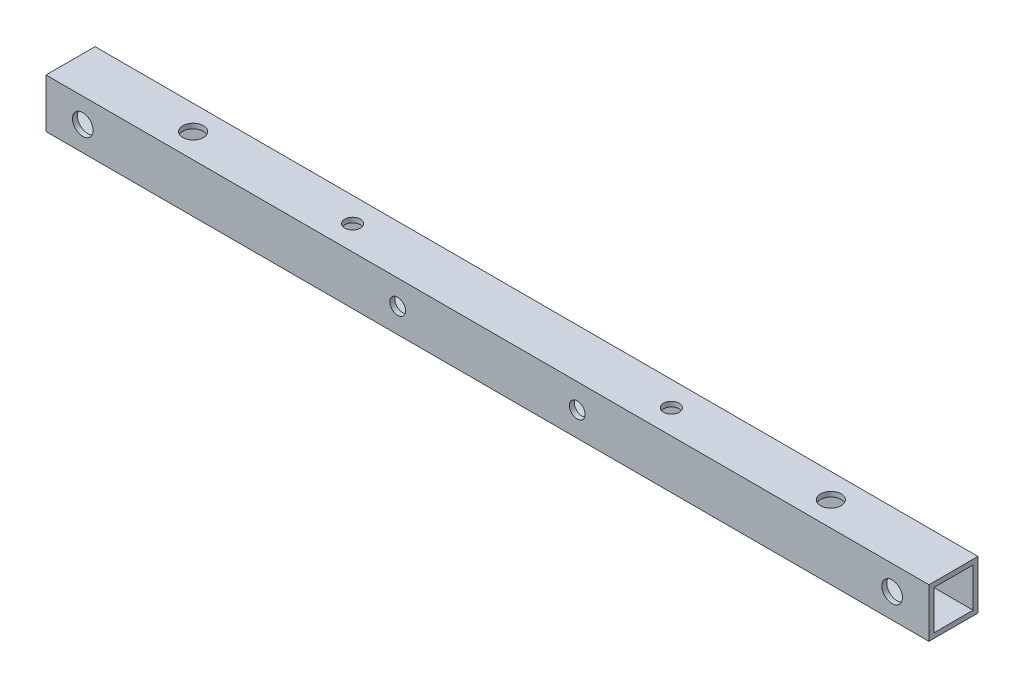
ISO-10303-21;
HEADER;
FILE_DESCRIPTION(('STEP AP214'),'2;1');
FILE_NAME('part.step','',(''),(''),'','','');
FILE_SCHEMA(('AUTOMOTIVE_DESIGN { 1 0 10303 214 1 1 1 1 }'));
ENDSEC;
DATA;
#1=APPLICATION_CONTEXT('core data for automotive mechanical design processes');
#2=APPLICATION_PROTOCOL_DEFINITION('international standard','automotive_design',2000,#1);
#3=PRODUCT_CONTEXT('',#1,'mechanical');
#4=PRODUCT('Part','Part','',(#3));
#5=PRODUCT_RELATED_PRODUCT_CATEGORY('part','',(#4));
#6=PRODUCT_DEFINITION_FORMATION('','',#4);
#7=PRODUCT_DEFINITION_CONTEXT('part definition',#1,'design');
#8=PRODUCT_DEFINITION('design','',#6,#7);
#9=PRODUCT_DEFINITION_SHAPE('','',#8);
#10=(LENGTH_UNIT() NAMED_UNIT(*) SI_UNIT(.MILLI.,.METRE.));
#11=(NAMED_UNIT(*) PLANE_ANGLE_UNIT() SI_UNIT($,.RADIAN.));
#12=(NAMED_UNIT(*) SI_UNIT($,.STERADIAN.) SOLID_ANGLE_UNIT());
#13=UNCERTAINTY_MEASURE_WITH_UNIT(LENGTH_MEASURE(1.E-05),#10,'distance_accuracy_value','');
#14=(GEOMETRIC_REPRESENTATION_CONTEXT(3) GLOBAL_UNCERTAINTY_ASSIGNED_CONTEXT((#13)) GLOBAL_UNIT_ASSIGNED_CONTEXT((#10,
#11,#12)) REPRESENTATION_CONTEXT('',''));
#15=CARTESIAN_POINT('',(0.,0.,0.));
#16=DIRECTION('',(0.,0.,1.));
#17=DIRECTION('',(1.,0.,0.));
#18=AXIS2_PLACEMENT_3D('',#15,#16,#17);
#19=CARTESIAN_POINT('',(180.,0.,0.));
#20=DIRECTION('',(1.,0.,0.));
#21=DIRECTION('',(0.,0.,-1.));
#22=AXIS2_PLACEMENT_3D('',#19,#20,#21);
#23=PLANE('',#22);
#24=DIRECTION('',(0.,1.,0.));
#25=VECTOR('',#24,1.);
#26=CARTESIAN_POINT('',(180.,5.,-5.));
#27=LINE('',#26,#25);
#28=CARTESIAN_POINT('',(180.,-5.,-5.));
#29=VERTEX_POINT('',#28);
#30=CARTESIAN_POINT('',(180.,5.,-5.));
#31=VERTEX_POINT('',#30);
#32=EDGE_CURVE('E164',#29,#31,#27,.T.);
#33=ORIENTED_EDGE('',*,*,#32,.T.);
#34=DIRECTION('',(0.,0.,1.));
#35=VECTOR('',#34,1.);
#36=CARTESIAN_POINT('',(180.,5.,5.));
#37=LINE('',#36,#35);
#38=CARTESIAN_POINT('',(180.,5.,5.));
#39=VERTEX_POINT('',#38);
#40=EDGE_CURVE('E167',#31,#39,#37,.T.);
#41=ORIENTED_EDGE('',*,*,#40,.T.);
#42=DIRECTION('',(0.,-1.,0.));
#43=VECTOR('',#42,1.);
#44=CARTESIAN_POINT('',(180.,5.,5.));
#45=LINE('',#44,#43);
#46=CARTESIAN_POINT('',(180.,-5.,5.));
#47=VERTEX_POINT('',#46);
#48=EDGE_CURVE('E170',#39,#47,#45,.T.);
#49=ORIENTED_EDGE('',*,*,#48,.T.);
#50=DIRECTION('',(0.,0.,-1.));
#51=VECTOR('',#50,1.);
#52=CARTESIAN_POINT('',(180.,-5.,5.));
#53=LINE('',#52,#51);
#54=EDGE_CURVE('E172',#47,#29,#53,.T.);
#55=ORIENTED_EDGE('',*,*,#54,.T.);
#56=EDGE_LOOP('',(#33,#41,#49,#55));
#57=FACE_BOUND('',#56,.T.);
#58=DIRECTION('',(0.,0.,1.));
#59=VECTOR('',#58,1.);
#60=CARTESIAN_POINT('',(180.,4.,5.));
#61=LINE('',#60,#59);
#62=CARTESIAN_POINT('',(180.,4.,-4.));
#63=VERTEX_POINT('',#62);
#64=CARTESIAN_POINT('',(180.,4.,4.));
#65=VERTEX_POINT('',#64);
#66=EDGE_CURVE('E134',#63,#65,#61,.T.);
#67=ORIENTED_EDGE('',*,*,#66,.F.);
#68=DIRECTION('',(0.,1.,0.));
#69=VECTOR('',#68,1.);
#70=CARTESIAN_POINT('',(180.,5.,-4.));
#71=LINE('',#70,#69);
#72=CARTESIAN_POINT('',(180.,-4.,-4.));
#73=VERTEX_POINT('',#72);
#74=EDGE_CURVE('E126',#73,#63,#71,.T.);
#75=ORIENTED_EDGE('',*,*,#74,.F.);
#76=DIRECTION('',(0.,0.,-1.));
#77=VECTOR('',#76,1.);
#78=CARTESIAN_POINT('',(180.,-4.,5.));
#79=LINE('',#78,#77);
#80=CARTESIAN_POINT('',(180.,-4.,4.));
#81=VERTEX_POINT('',#80);
#82=EDGE_CURVE('E148',#81,#73,#79,.T.);
#83=ORIENTED_EDGE('',*,*,#82,.F.);
#84=DIRECTION('',(0.,-1.,0.));
#85=VECTOR('',#84,1.);
#86=CARTESIAN_POINT('',(180.,5.,4.));
#87=LINE('',#86,#85);
#88=EDGE_CURVE('E146',#65,#81,#87,.T.);
#89=ORIENTED_EDGE('',*,*,#88,.F.);
#90=EDGE_LOOP('',(#67,#75,#83,#89));
#91=FACE_BOUND('',#90,.T.);
#92=ADVANCED_FACE('F59',(#57,#91),#23,.T.);
#93=CARTESIAN_POINT('',(0.,0.,0.));
#94=DIRECTION('',(1.,0.,0.));
#95=DIRECTION('',(0.,0.,-1.));
#96=AXIS2_PLACEMENT_3D('',#93,#94,#95);
#97=PLANE('',#96);
#98=DIRECTION('',(0.,1.,0.));
#99=VECTOR('',#98,1.);
#100=CARTESIAN_POINT('',(0.,5.,-5.));
#101=LINE('',#100,#99);
#102=CARTESIAN_POINT('',(0.,-5.,-5.));
#103=VERTEX_POINT('',#102);
#104=CARTESIAN_POINT('',(0.,5.,-5.));
#105=VERTEX_POINT('',#104);
#106=EDGE_CURVE('E142',#103,#105,#101,.T.);
#107=ORIENTED_EDGE('',*,*,#106,.F.);
#108=DIRECTION('',(0.,0.,-1.));
#109=VECTOR('',#108,1.);
#110=CARTESIAN_POINT('',(0.,-5.,5.));
#111=LINE('',#110,#109);
#112=CARTESIAN_POINT('',(0.,-5.,5.));
#113=VERTEX_POINT('',#112);
#114=EDGE_CURVE('E168',#113,#103,#111,.T.);
#115=ORIENTED_EDGE('',*,*,#114,.F.);
#116=DIRECTION('',(0.,-1.,0.));
#117=VECTOR('',#116,1.);
#118=CARTESIAN_POINT('',(0.,5.,5.));
#119=LINE('',#118,#117);
#120=CARTESIAN_POINT('',(0.,5.,5.));
#121=VERTEX_POINT('',#120);
#122=EDGE_CURVE('E179',#121,#113,#119,.T.);
#123=ORIENTED_EDGE('',*,*,#122,.F.);
#124=DIRECTION('',(0.,0.,1.));
#125=VECTOR('',#124,1.);
#126=CARTESIAN_POINT('',(0.,5.,5.));
#127=LINE('',#126,#125);
#128=EDGE_CURVE('E177',#105,#121,#127,.T.);
#129=ORIENTED_EDGE('',*,*,#128,.F.);
#130=EDGE_LOOP('',(#107,#115,#123,#129));
#131=FACE_BOUND('',#130,.T.);
#132=DIRECTION('',(0.,1.,0.));
#133=VECTOR('',#132,1.);
#134=CARTESIAN_POINT('',(0.,5.,-4.));
#135=LINE('',#134,#133);
#136=CARTESIAN_POINT('',(0.,-4.,-4.));
#137=VERTEX_POINT('',#136);
#138=CARTESIAN_POINT('',(0.,4.,-4.));
#139=VERTEX_POINT('',#138);
#140=EDGE_CURVE('E84',#137,#139,#135,.T.);
#141=ORIENTED_EDGE('',*,*,#140,.T.);
#142=DIRECTION('',(0.,0.,1.));
#143=VECTOR('',#142,1.);
#144=CARTESIAN_POINT('',(0.,4.,5.));
#145=LINE('',#144,#143);
#146=CARTESIAN_POINT('',(0.,4.,4.));
#147=VERTEX_POINT('',#146);
#148=EDGE_CURVE('E141',#139,#147,#145,.T.);
#149=ORIENTED_EDGE('',*,*,#148,.T.);
#150=DIRECTION('',(0.,-1.,0.));
#151=VECTOR('',#150,1.);
#152=CARTESIAN_POINT('',(0.,5.,4.));
#153=LINE('',#152,#151);
#154=CARTESIAN_POINT('',(0.,-4.,4.));
#155=VERTEX_POINT('',#154);
#156=EDGE_CURVE('E156',#147,#155,#153,.T.);
#157=ORIENTED_EDGE('',*,*,#156,.T.);
#158=DIRECTION('',(0.,0.,-1.));
#159=VECTOR('',#158,1.);
#160=CARTESIAN_POINT('',(0.,-4.,5.));
#161=LINE('',#160,#159);
#162=EDGE_CURVE('E135',#155,#137,#161,.T.);
#163=ORIENTED_EDGE('',*,*,#162,.T.);
#164=EDGE_LOOP('',(#141,#149,#157,#163));
#165=FACE_BOUND('',#164,.T.);
#166=ADVANCED_FACE('F305',(#131,#165),#97,.F.);
#167=CARTESIAN_POINT('',(180.,5.,-5.));
#168=DIRECTION('',(0.,0.,1.));
#169=DIRECTION('',(0.,-1.,0.));
#170=AXIS2_PLACEMENT_3D('',#167,#168,#169);
#171=PLANE('',#170);
#172=CARTESIAN_POINT('',(71.7,0.,-5.));
#173=DIRECTION('',(0.,0.,1.));
#174=DIRECTION('',(1.,0.,0.));
#175=AXIS2_PLACEMENT_3D('',#172,#173,#174);
#176=CIRCLE('',#175,1.60000000000001);
#177=CARTESIAN_POINT('',(73.3,0.,-5.));
#178=VERTEX_POINT('',#177);
#179=EDGE_CURVE('E210',#178,#178,#176,.T.);
#180=ORIENTED_EDGE('',*,*,#179,.T.);
#181=EDGE_LOOP('',(#180));
#182=FACE_BOUND('',#181,.T.);
#183=CARTESIAN_POINT('',(108.3,0.,-5.));
#184=DIRECTION('',(0.,0.,1.));
#185=DIRECTION('',(-1.,0.,0.));
#186=AXIS2_PLACEMENT_3D('',#183,#184,#185);
#187=CIRCLE('',#186,1.60000000000001);
#188=CARTESIAN_POINT('',(106.7,0.,-5.));
#189=VERTEX_POINT('',#188);
#190=EDGE_CURVE('E245',#189,#189,#187,.T.);
#191=ORIENTED_EDGE('',*,*,#190,.T.);
#192=EDGE_LOOP('',(#191));
#193=FACE_BOUND('',#192,.T.);
#194=CARTESIAN_POINT('',(7.5,0.,-5.));
#195=DIRECTION('',(0.,0.,1.));
#196=DIRECTION('',(1.,0.,0.));
#197=AXIS2_PLACEMENT_3D('',#194,#195,#196);
#198=CIRCLE('',#197,2.1);
#199=CARTESIAN_POINT('',(9.6,0.,-5.));
#200=VERTEX_POINT('',#199);
#201=EDGE_CURVE('E193',#200,#200,#198,.T.);
#202=ORIENTED_EDGE('',*,*,#201,.T.);
#203=EDGE_LOOP('',(#202));
#204=FACE_BOUND('',#203,.T.);
#205=CARTESIAN_POINT('',(172.5,0.,-5.));
#206=DIRECTION('',(0.,0.,1.));
#207=DIRECTION('',(-1.,0.,0.));
#208=AXIS2_PLACEMENT_3D('',#205,#206,#207);
#209=CIRCLE('',#208,2.10000000000002);
#210=CARTESIAN_POINT('',(170.4,0.,-5.));
#211=VERTEX_POINT('',#210);
#212=EDGE_CURVE('E275',#211,#211,#209,.T.);
#213=ORIENTED_EDGE('',*,*,#212,.T.);
#214=EDGE_LOOP('',(#213));
#215=FACE_BOUND('',#214,.T.);
#216=ORIENTED_EDGE('',*,*,#106,.T.);
#217=DIRECTION('',(-1.,0.,0.));
#218=VECTOR('',#217,1.);
#219=CARTESIAN_POINT('',(180.,5.,-5.));
#220=LINE('',#219,#218);
#221=EDGE_CURVE('E12',#31,#105,#220,.T.);
#222=ORIENTED_EDGE('',*,*,#221,.F.);
#223=ORIENTED_EDGE('',*,*,#32,.F.);
#224=DIRECTION('',(-1.,0.,0.));
#225=VECTOR('',#224,1.);
#226=CARTESIAN_POINT('',(180.,-5.,-5.));
#227=LINE('',#226,#225);
#228=EDGE_CURVE('E174',#29,#103,#227,.T.);
#229=ORIENTED_EDGE('',*,*,#228,.T.);
#230=EDGE_LOOP('',(#216,#222,#223,#229));
#231=FACE_BOUND('',#230,.T.);
#232=ADVANCED_FACE('F61',(#182,#193,#204,#215,#231),#171,.F.);
#233=CARTESIAN_POINT('',(180.,5.,5.));
#234=DIRECTION('',(0.,-1.,0.));
#235=DIRECTION('',(0.,0.,-1.));
#236=AXIS2_PLACEMENT_3D('',#233,#234,#235);
#237=PLANE('',#236);
#238=CARTESIAN_POINT('',(57.5,5.,0.));
#239=DIRECTION('',(0.,1.,0.));
#240=DIRECTION('',(0.,0.,1.));
#241=AXIS2_PLACEMENT_3D('',#238,#239,#240);
#242=CIRCLE('',#241,1.6);
#243=CARTESIAN_POINT('',(57.5,5.,1.6));
#244=VERTEX_POINT('',#243);
#245=EDGE_CURVE('E223',#244,#244,#242,.T.);
#246=ORIENTED_EDGE('',*,*,#245,.F.);
#247=EDGE_LOOP('',(#246));
#248=FACE_BOUND('',#247,.T.);
#249=CARTESIAN_POINT('',(122.5,5.,0.));
#250=DIRECTION('',(0.,1.,0.));
#251=DIRECTION('',(0.,0.,-1.));
#252=AXIS2_PLACEMENT_3D('',#249,#250,#251);
#253=CIRCLE('',#252,1.59999999999999);
#254=CARTESIAN_POINT('',(122.5,5.,-1.59999999999999));
#255=VERTEX_POINT('',#254);
#256=EDGE_CURVE('E233',#255,#255,#253,.T.);
#257=ORIENTED_EDGE('',*,*,#256,.F.);
#258=EDGE_LOOP('',(#257));
#259=FACE_BOUND('',#258,.T.);
#260=CARTESIAN_POINT('',(25.,5.,0.));
#261=DIRECTION('',(0.,1.,0.));
#262=DIRECTION('',(0.,0.,1.));
#263=AXIS2_PLACEMENT_3D('',#260,#261,#262);
#264=CIRCLE('',#263,2.1);
#265=CARTESIAN_POINT('',(25.,5.,2.1));
#266=VERTEX_POINT('',#265);
#267=EDGE_CURVE('E257',#266,#266,#264,.T.);
#268=ORIENTED_EDGE('',*,*,#267,.F.);
#269=EDGE_LOOP('',(#268));
#270=FACE_BOUND('',#269,.T.);
#271=CARTESIAN_POINT('',(155.,5.,0.));
#272=DIRECTION('',(0.,1.,0.));
#273=DIRECTION('',(0.,0.,-1.));
#274=AXIS2_PLACEMENT_3D('',#271,#272,#273);
#275=CIRCLE('',#274,2.09999999999996);
#276=CARTESIAN_POINT('',(155.,5.,-2.09999999999998));
#277=VERTEX_POINT('',#276);
#278=EDGE_CURVE('E254',#277,#277,#275,.T.);
#279=ORIENTED_EDGE('',*,*,#278,.F.);
#280=EDGE_LOOP('',(#279));
#281=FACE_BOUND('',#280,.T.);
#282=ORIENTED_EDGE('',*,*,#128,.T.);
#283=DIRECTION('',(-1.,0.,0.));
#284=VECTOR('',#283,1.);
#285=CARTESIAN_POINT('',(180.,5.,5.));
#286=LINE('',#285,#284);
#287=EDGE_CURVE('E68',#39,#121,#286,.T.);
#288=ORIENTED_EDGE('',*,*,#287,.F.);
#289=ORIENTED_EDGE('',*,*,#40,.F.);
#290=ORIENTED_EDGE('',*,*,#221,.T.);
#291=EDGE_LOOP('',(#282,#288,#289,#290));
#292=FACE_BOUND('',#291,.T.);
#293=ADVANCED_FACE('F304',(#248,#259,#270,#281,#292),#237,.F.);
#294=CARTESIAN_POINT('',(180.,5.,5.));
#295=DIRECTION('',(0.,0.,-1.));
#296=DIRECTION('',(0.,1.,0.));
#297=AXIS2_PLACEMENT_3D('',#294,#295,#296);
#298=PLANE('',#297);
#299=CARTESIAN_POINT('',(71.7,0.,5.));
#300=DIRECTION('',(0.,0.,1.));
#301=DIRECTION('',(1.,0.,0.));
#302=AXIS2_PLACEMENT_3D('',#299,#300,#301);
#303=CIRCLE('',#302,1.60000000000001);
#304=CARTESIAN_POINT('',(73.3,0.,5.));
#305=VERTEX_POINT('',#304);
#306=EDGE_CURVE('E242',#305,#305,#303,.T.);
#307=ORIENTED_EDGE('',*,*,#306,.F.);
#308=EDGE_LOOP('',(#307));
#309=FACE_BOUND('',#308,.T.);
#310=CARTESIAN_POINT('',(108.3,0.,5.));
#311=DIRECTION('',(0.,0.,1.));
#312=DIRECTION('',(-1.,0.,0.));
#313=AXIS2_PLACEMENT_3D('',#310,#311,#312);
#314=CIRCLE('',#313,1.60000000000001);
#315=CARTESIAN_POINT('',(106.7,0.,5.));
#316=VERTEX_POINT('',#315);
#317=EDGE_CURVE('E239',#316,#316,#314,.T.);
#318=ORIENTED_EDGE('',*,*,#317,.F.);
#319=EDGE_LOOP('',(#318));
#320=FACE_BOUND('',#319,.T.);
#321=CARTESIAN_POINT('',(7.5,0.,5.));
#322=DIRECTION('',(0.,0.,1.));
#323=DIRECTION('',(1.,0.,0.));
#324=AXIS2_PLACEMENT_3D('',#321,#322,#323);
#325=CIRCLE('',#324,2.1);
#326=CARTESIAN_POINT('',(9.6,0.,5.));
#327=VERTEX_POINT('',#326);
#328=EDGE_CURVE('E272',#327,#327,#325,.T.);
#329=ORIENTED_EDGE('',*,*,#328,.F.);
#330=EDGE_LOOP('',(#329));
#331=FACE_BOUND('',#330,.T.);
#332=CARTESIAN_POINT('',(172.5,0.,5.));
#333=DIRECTION('',(0.,0.,1.));
#334=DIRECTION('',(-1.,0.,0.));
#335=AXIS2_PLACEMENT_3D('',#332,#333,#334);
#336=CIRCLE('',#335,2.10000000000002);
#337=CARTESIAN_POINT('',(170.4,0.,5.));
#338=VERTEX_POINT('',#337);
#339=EDGE_CURVE('E269',#338,#338,#336,.T.);
#340=ORIENTED_EDGE('',*,*,#339,.F.);
#341=EDGE_LOOP('',(#340));
#342=FACE_BOUND('',#341,.T.);
#343=ORIENTED_EDGE('',*,*,#122,.T.);
#344=DIRECTION('',(-1.,0.,0.));
#345=VECTOR('',#344,1.);
#346=CARTESIAN_POINT('',(180.,-5.,5.));
#347=LINE('',#346,#345);
#348=EDGE_CURVE('E184',#47,#113,#347,.T.);
#349=ORIENTED_EDGE('',*,*,#348,.F.);
#350=ORIENTED_EDGE('',*,*,#48,.F.);
#351=ORIENTED_EDGE('',*,*,#287,.T.);
#352=EDGE_LOOP('',(#343,#349,#350,#351));
#353=FACE_BOUND('',#352,.T.);
#354=ADVANCED_FACE('F323',(#309,#320,#331,#342,#353),#298,.F.);
#355=CARTESIAN_POINT('',(180.,-5.,5.));
#356=DIRECTION('',(0.,1.,0.));
#357=DIRECTION('',(0.,0.,1.));
#358=AXIS2_PLACEMENT_3D('',#355,#356,#357);
#359=PLANE('',#358);
#360=CARTESIAN_POINT('',(57.5,-5.,0.));
#361=DIRECTION('',(0.,1.,0.));
#362=DIRECTION('',(0.,0.,1.));
#363=AXIS2_PLACEMENT_3D('',#360,#361,#362);
#364=CIRCLE('',#363,1.6);
#365=CARTESIAN_POINT('',(57.5,-5.,1.6));
#366=VERTEX_POINT('',#365);
#367=EDGE_CURVE('E217',#366,#366,#364,.T.);
#368=ORIENTED_EDGE('',*,*,#367,.T.);
#369=EDGE_LOOP('',(#368));
#370=FACE_BOUND('',#369,.T.);
#371=CARTESIAN_POINT('',(122.5,-5.,0.));
#372=DIRECTION('',(0.,1.,0.));
#373=DIRECTION('',(0.,0.,-1.));
#374=AXIS2_PLACEMENT_3D('',#371,#372,#373);
#375=CIRCLE('',#374,1.59999999999999);
#376=CARTESIAN_POINT('',(122.5,-5.,-1.59999999999999));
#377=VERTEX_POINT('',#376);
#378=EDGE_CURVE('E228',#377,#377,#375,.T.);
#379=ORIENTED_EDGE('',*,*,#378,.T.);
#380=EDGE_LOOP('',(#379));
#381=FACE_BOUND('',#380,.T.);
#382=CARTESIAN_POINT('',(25.,-5.,0.));
#383=DIRECTION('',(0.,1.,0.));
#384=DIRECTION('',(0.,0.,1.));
#385=AXIS2_PLACEMENT_3D('',#382,#383,#384);
#386=CIRCLE('',#385,2.1);
#387=CARTESIAN_POINT('',(25.,-5.,2.1));
#388=VERTEX_POINT('',#387);
#389=EDGE_CURVE('E201',#388,#388,#386,.T.);
#390=ORIENTED_EDGE('',*,*,#389,.T.);
#391=EDGE_LOOP('',(#390));
#392=FACE_BOUND('',#391,.T.);
#393=CARTESIAN_POINT('',(155.,-5.,0.));
#394=DIRECTION('',(0.,1.,0.));
#395=DIRECTION('',(0.,0.,-1.));
#396=AXIS2_PLACEMENT_3D('',#393,#394,#395);
#397=CIRCLE('',#396,2.09999999999996);
#398=CARTESIAN_POINT('',(155.,-5.,-2.09999999999998));
#399=VERTEX_POINT('',#398);
#400=EDGE_CURVE('E260',#399,#399,#397,.T.);
#401=ORIENTED_EDGE('',*,*,#400,.T.);
#402=EDGE_LOOP('',(#401));
#403=FACE_BOUND('',#402,.T.);
#404=ORIENTED_EDGE('',*,*,#114,.T.);
#405=ORIENTED_EDGE('',*,*,#228,.F.);
#406=ORIENTED_EDGE('',*,*,#54,.F.);
#407=ORIENTED_EDGE('',*,*,#348,.T.);
#408=EDGE_LOOP('',(#404,#405,#406,#407));
#409=FACE_BOUND('',#408,.T.);
#410=ADVANCED_FACE('F289',(#370,#381,#392,#403,#409),#359,.F.);
#411=CARTESIAN_POINT('',(180.,5.,-4.));
#412=DIRECTION('',(0.,0.,1.));
#413=DIRECTION('',(0.,-1.,0.));
#414=AXIS2_PLACEMENT_3D('',#411,#412,#413);
#415=PLANE('',#414);
#416=CARTESIAN_POINT('',(71.7,0.,-4.));
#417=DIRECTION('',(0.,0.,1.));
#418=DIRECTION('',(0.,-1.,0.));
#419=AXIS2_PLACEMENT_3D('',#416,#417,#418);
#420=CIRCLE('',#419,1.60000000000001);
#421=CARTESIAN_POINT('',(71.7,-1.60000000000001,-4.));
#422=VERTEX_POINT('',#421);
#423=EDGE_CURVE('E213',#422,#422,#420,.T.);
#424=ORIENTED_EDGE('',*,*,#423,.F.);
#425=EDGE_LOOP('',(#424));
#426=FACE_BOUND('',#425,.T.);
#427=CARTESIAN_POINT('',(108.3,0.,-4.));
#428=DIRECTION('',(0.,0.,1.));
#429=DIRECTION('',(0.,-1.,0.));
#430=AXIS2_PLACEMENT_3D('',#427,#428,#429);
#431=CIRCLE('',#430,1.60000000000001);
#432=CARTESIAN_POINT('',(108.3,-1.6,-4.));
#433=VERTEX_POINT('',#432);
#434=EDGE_CURVE('E209',#433,#433,#431,.T.);
#435=ORIENTED_EDGE('',*,*,#434,.F.);
#436=EDGE_LOOP('',(#435));
#437=FACE_BOUND('',#436,.T.);
#438=CARTESIAN_POINT('',(7.5,0.,-4.));
#439=DIRECTION('',(0.,0.,1.));
#440=DIRECTION('',(0.,-1.,0.));
#441=AXIS2_PLACEMENT_3D('',#438,#439,#440);
#442=CIRCLE('',#441,2.1);
#443=CARTESIAN_POINT('',(7.5,-2.1,-4.));
#444=VERTEX_POINT('',#443);
#445=EDGE_CURVE('E154',#444,#444,#442,.T.);
#446=ORIENTED_EDGE('',*,*,#445,.F.);
#447=EDGE_LOOP('',(#446));
#448=FACE_BOUND('',#447,.T.);
#449=CARTESIAN_POINT('',(172.5,0.,-4.));
#450=DIRECTION('',(0.,0.,1.));
#451=DIRECTION('',(0.,-1.,0.));
#452=AXIS2_PLACEMENT_3D('',#449,#450,#451);
#453=CIRCLE('',#452,2.10000000000002);
#454=CARTESIAN_POINT('',(172.5,-2.1,-4.));
#455=VERTEX_POINT('',#454);
#456=EDGE_CURVE('E192',#455,#455,#453,.T.);
#457=ORIENTED_EDGE('',*,*,#456,.F.);
#458=EDGE_LOOP('',(#457));
#459=FACE_BOUND('',#458,.T.);
#460=ORIENTED_EDGE('',*,*,#140,.F.);
#461=DIRECTION('',(-1.,0.,0.));
#462=VECTOR('',#461,1.);
#463=CARTESIAN_POINT('',(180.,-4.,-4.));
#464=LINE('',#463,#462);
#465=EDGE_CURVE('E130',#73,#137,#464,.T.);
#466=ORIENTED_EDGE('',*,*,#465,.F.);
#467=ORIENTED_EDGE('',*,*,#74,.T.);
#468=DIRECTION('',(-1.,0.,0.));
#469=VECTOR('',#468,1.);
#470=CARTESIAN_POINT('',(180.,4.,-4.));
#471=LINE('',#470,#469);
#472=EDGE_CURVE('E129',#63,#139,#471,.T.);
#473=ORIENTED_EDGE('',*,*,#472,.T.);
#474=EDGE_LOOP('',(#460,#466,#467,#473));
#475=FACE_BOUND('',#474,.T.);
#476=ADVANCED_FACE('F128',(#426,#437,#448,#459,#475),#415,.T.);
#477=CARTESIAN_POINT('',(180.,4.,5.));
#478=DIRECTION('',(0.,-1.,0.));
#479=DIRECTION('',(0.,0.,-1.));
#480=AXIS2_PLACEMENT_3D('',#477,#478,#479);
#481=PLANE('',#480);
#482=CARTESIAN_POINT('',(57.5,4.,0.));
#483=DIRECTION('',(0.,-1.,0.));
#484=DIRECTION('',(0.,0.,-1.));
#485=AXIS2_PLACEMENT_3D('',#482,#483,#484);
#486=CIRCLE('',#485,1.6);
#487=CARTESIAN_POINT('',(57.5,4.,-1.59999999999999));
#488=VERTEX_POINT('',#487);
#489=EDGE_CURVE('E236',#488,#488,#486,.T.);
#490=ORIENTED_EDGE('',*,*,#489,.F.);
#491=EDGE_LOOP('',(#490));
#492=FACE_BOUND('',#491,.T.);
#493=CARTESIAN_POINT('',(122.5,4.,0.));
#494=DIRECTION('',(0.,-1.,0.));
#495=DIRECTION('',(0.,0.,-1.));
#496=AXIS2_PLACEMENT_3D('',#493,#494,#495);
#497=CIRCLE('',#496,1.59999999999999);
#498=CARTESIAN_POINT('',(122.5,4.,-1.59999999999999));
#499=VERTEX_POINT('',#498);
#500=EDGE_CURVE('E216',#499,#499,#497,.T.);
#501=ORIENTED_EDGE('',*,*,#500,.F.);
#502=EDGE_LOOP('',(#501));
#503=FACE_BOUND('',#502,.T.);
#504=CARTESIAN_POINT('',(25.,4.,0.));
#505=DIRECTION('',(0.,-1.,0.));
#506=DIRECTION('',(0.,0.,-1.));
#507=AXIS2_PLACEMENT_3D('',#504,#505,#506);
#508=CIRCLE('',#507,2.1);
#509=CARTESIAN_POINT('',(25.,4.,-2.1));
#510=VERTEX_POINT('',#509);
#511=EDGE_CURVE('E205',#510,#510,#508,.T.);
#512=ORIENTED_EDGE('',*,*,#511,.F.);
#513=EDGE_LOOP('',(#512));
#514=FACE_BOUND('',#513,.T.);
#515=CARTESIAN_POINT('',(155.,4.,0.));
#516=DIRECTION('',(0.,-1.,0.));
#517=DIRECTION('',(0.,0.,-1.));
#518=AXIS2_PLACEMENT_3D('',#515,#516,#517);
#519=CIRCLE('',#518,2.09999999999996);
#520=CARTESIAN_POINT('',(155.,4.,-2.09999999999998));
#521=VERTEX_POINT('',#520);
#522=EDGE_CURVE('E200',#521,#521,#519,.T.);
#523=ORIENTED_EDGE('',*,*,#522,.F.);
#524=EDGE_LOOP('',(#523));
#525=FACE_BOUND('',#524,.T.);
#526=ORIENTED_EDGE('',*,*,#148,.F.);
#527=ORIENTED_EDGE('',*,*,#472,.F.);
#528=ORIENTED_EDGE('',*,*,#66,.T.);
#529=DIRECTION('',(-1.,0.,0.));
#530=VECTOR('',#529,1.);
#531=CARTESIAN_POINT('',(180.,4.,4.));
#532=LINE('',#531,#530);
#533=EDGE_CURVE('E143',#65,#147,#532,.T.);
#534=ORIENTED_EDGE('',*,*,#533,.T.);
#535=EDGE_LOOP('',(#526,#527,#528,#534));
#536=FACE_BOUND('',#535,.T.);
#537=ADVANCED_FACE('F138',(#492,#503,#514,#525,#536),#481,.T.);
#538=CARTESIAN_POINT('',(180.,5.,4.));
#539=DIRECTION('',(0.,0.,-1.));
#540=DIRECTION('',(0.,1.,0.));
#541=AXIS2_PLACEMENT_3D('',#538,#539,#540);
#542=PLANE('',#541);
#543=CARTESIAN_POINT('',(71.7,0.,4.));
#544=DIRECTION('',(0.,0.,-1.));
#545=DIRECTION('',(0.,1.,0.));
#546=AXIS2_PLACEMENT_3D('',#543,#544,#545);
#547=CIRCLE('',#546,1.60000000000001);
#548=CARTESIAN_POINT('',(71.7,1.6,4.));
#549=VERTEX_POINT('',#548);
#550=EDGE_CURVE('E211',#549,#549,#547,.T.);
#551=ORIENTED_EDGE('',*,*,#550,.F.);
#552=EDGE_LOOP('',(#551));
#553=FACE_BOUND('',#552,.T.);
#554=CARTESIAN_POINT('',(108.3,0.,4.));
#555=DIRECTION('',(0.,0.,-1.));
#556=DIRECTION('',(0.,1.,0.));
#557=AXIS2_PLACEMENT_3D('',#554,#555,#556);
#558=CIRCLE('',#557,1.60000000000001);
#559=CARTESIAN_POINT('',(108.3,1.60000000000001,4.));
#560=VERTEX_POINT('',#559);
#561=EDGE_CURVE('E206',#560,#560,#558,.T.);
#562=ORIENTED_EDGE('',*,*,#561,.F.);
#563=EDGE_LOOP('',(#562));
#564=FACE_BOUND('',#563,.T.);
#565=CARTESIAN_POINT('',(7.5,0.,4.));
#566=DIRECTION('',(0.,0.,-1.));
#567=DIRECTION('',(0.,1.,0.));
#568=AXIS2_PLACEMENT_3D('',#565,#566,#567);
#569=CIRCLE('',#568,2.1);
#570=CARTESIAN_POINT('',(7.5,2.1,4.));
#571=VERTEX_POINT('',#570);
#572=EDGE_CURVE('E194',#571,#571,#569,.T.);
#573=ORIENTED_EDGE('',*,*,#572,.F.);
#574=EDGE_LOOP('',(#573));
#575=FACE_BOUND('',#574,.T.);
#576=CARTESIAN_POINT('',(172.5,0.,4.));
#577=DIRECTION('',(0.,0.,-1.));
#578=DIRECTION('',(0.,1.,0.));
#579=AXIS2_PLACEMENT_3D('',#576,#577,#578);
#580=CIRCLE('',#579,2.10000000000002);
#581=CARTESIAN_POINT('',(172.5,2.10000000000004,4.));
#582=VERTEX_POINT('',#581);
#583=EDGE_CURVE('E189',#582,#582,#580,.T.);
#584=ORIENTED_EDGE('',*,*,#583,.F.);
#585=EDGE_LOOP('',(#584));
#586=FACE_BOUND('',#585,.T.);
#587=ORIENTED_EDGE('',*,*,#156,.F.);
#588=ORIENTED_EDGE('',*,*,#533,.F.);
#589=ORIENTED_EDGE('',*,*,#88,.T.);
#590=DIRECTION('',(-1.,0.,0.));
#591=VECTOR('',#590,1.);
#592=CARTESIAN_POINT('',(180.,-4.,4.));
#593=LINE('',#592,#591);
#594=EDGE_CURVE('E76',#81,#155,#593,.T.);
#595=ORIENTED_EDGE('',*,*,#594,.T.);
#596=EDGE_LOOP('',(#587,#588,#589,#595));
#597=FACE_BOUND('',#596,.T.);
#598=ADVANCED_FACE('F344',(#553,#564,#575,#586,#597),#542,.T.);
#599=CARTESIAN_POINT('',(180.,-4.,5.));
#600=DIRECTION('',(0.,1.,0.));
#601=DIRECTION('',(0.,0.,1.));
#602=AXIS2_PLACEMENT_3D('',#599,#600,#601);
#603=PLANE('',#602);
#604=CARTESIAN_POINT('',(57.5,-4.,0.));
#605=DIRECTION('',(0.,1.,0.));
#606=DIRECTION('',(0.,0.,1.));
#607=AXIS2_PLACEMENT_3D('',#604,#605,#606);
#608=CIRCLE('',#607,1.6);
#609=CARTESIAN_POINT('',(57.5,-4.,1.6));
#610=VERTEX_POINT('',#609);
#611=EDGE_CURVE('E63',#610,#610,#608,.T.);
#612=ORIENTED_EDGE('',*,*,#611,.F.);
#613=EDGE_LOOP('',(#612));
#614=FACE_BOUND('',#613,.T.);
#615=CARTESIAN_POINT('',(122.5,-4.,0.));
#616=DIRECTION('',(0.,1.,0.));
#617=DIRECTION('',(0.,0.,1.));
#618=AXIS2_PLACEMENT_3D('',#615,#616,#617);
#619=CIRCLE('',#618,1.59999999999999);
#620=CARTESIAN_POINT('',(122.5,-4.,1.59999999999999));
#621=VERTEX_POINT('',#620);
#622=EDGE_CURVE('E214',#621,#621,#619,.T.);
#623=ORIENTED_EDGE('',*,*,#622,.F.);
#624=EDGE_LOOP('',(#623));
#625=FACE_BOUND('',#624,.T.);
#626=CARTESIAN_POINT('',(25.,-4.,0.));
#627=DIRECTION('',(0.,1.,0.));
#628=DIRECTION('',(0.,0.,1.));
#629=AXIS2_PLACEMENT_3D('',#626,#627,#628);
#630=CIRCLE('',#629,2.1);
#631=CARTESIAN_POINT('',(25.,-4.,2.1));
#632=VERTEX_POINT('',#631);
#633=EDGE_CURVE('E202',#632,#632,#630,.T.);
#634=ORIENTED_EDGE('',*,*,#633,.F.);
#635=EDGE_LOOP('',(#634));
#636=FACE_BOUND('',#635,.T.);
#637=CARTESIAN_POINT('',(155.,-4.,0.));
#638=DIRECTION('',(0.,1.,0.));
#639=DIRECTION('',(0.,0.,1.));
#640=AXIS2_PLACEMENT_3D('',#637,#638,#639);
#641=CIRCLE('',#640,2.09999999999996);
#642=CARTESIAN_POINT('',(155.,-4.,2.09999999999995));
#643=VERTEX_POINT('',#642);
#644=EDGE_CURVE('E197',#643,#643,#641,.T.);
#645=ORIENTED_EDGE('',*,*,#644,.F.);
#646=EDGE_LOOP('',(#645));
#647=FACE_BOUND('',#646,.T.);
#648=ORIENTED_EDGE('',*,*,#162,.F.);
#649=ORIENTED_EDGE('',*,*,#594,.F.);
#650=ORIENTED_EDGE('',*,*,#82,.T.);
#651=ORIENTED_EDGE('',*,*,#465,.T.);
#652=EDGE_LOOP('',(#648,#649,#650,#651));
#653=FACE_BOUND('',#652,.T.);
#654=ADVANCED_FACE('F348',(#614,#625,#636,#647,#653),#603,.T.);
#655=CARTESIAN_POINT('',(172.5,0.,-5.));
#656=DIRECTION('',(0.,0.,1.));
#657=DIRECTION('',(1.,0.,0.));
#658=AXIS2_PLACEMENT_3D('',#655,#656,#657);
#659=CYLINDRICAL_SURFACE('',#658,2.10000000000002);
#660=ORIENTED_EDGE('',*,*,#583,.T.);
#661=EDGE_LOOP('',(#660));
#662=FACE_BOUND('',#661,.T.);
#663=ORIENTED_EDGE('',*,*,#339,.T.);
#664=EDGE_LOOP('',(#663));
#665=FACE_BOUND('',#664,.T.);
#666=ADVANCED_FACE('F299',(#662,#665),#659,.F.);
#667=CARTESIAN_POINT('',(7.5,0.,-5.));
#668=DIRECTION('',(0.,0.,1.));
#669=DIRECTION('',(1.,0.,0.));
#670=AXIS2_PLACEMENT_3D('',#667,#668,#669);
#671=CYLINDRICAL_SURFACE('',#670,2.1);
#672=ORIENTED_EDGE('',*,*,#572,.T.);
#673=EDGE_LOOP('',(#672));
#674=FACE_BOUND('',#673,.T.);
#675=ORIENTED_EDGE('',*,*,#328,.T.);
#676=EDGE_LOOP('',(#675));
#677=FACE_BOUND('',#676,.T.);
#678=ADVANCED_FACE('F297',(#674,#677),#671,.F.);
#679=ORIENTED_EDGE('',*,*,#456,.T.);
#680=EDGE_LOOP('',(#679));
#681=FACE_BOUND('',#680,.T.);
#682=ORIENTED_EDGE('',*,*,#212,.F.);
#683=EDGE_LOOP('',(#682));
#684=FACE_BOUND('',#683,.T.);
#685=ADVANCED_FACE('F294',(#681,#684),#659,.F.);
#686=ORIENTED_EDGE('',*,*,#445,.T.);
#687=EDGE_LOOP('',(#686));
#688=FACE_BOUND('',#687,.T.);
#689=ORIENTED_EDGE('',*,*,#201,.F.);
#690=EDGE_LOOP('',(#689));
#691=FACE_BOUND('',#690,.T.);
#692=ADVANCED_FACE('F284',(#688,#691),#671,.F.);
#693=CARTESIAN_POINT('',(155.,-5.,0.));
#694=DIRECTION('',(0.,1.,0.));
#695=DIRECTION('',(0.,0.,1.));
#696=AXIS2_PLACEMENT_3D('',#693,#694,#695);
#697=CYLINDRICAL_SURFACE('',#696,2.09999999999996);
#698=ORIENTED_EDGE('',*,*,#644,.T.);
#699=EDGE_LOOP('',(#698));
#700=FACE_BOUND('',#699,.T.);
#701=ORIENTED_EDGE('',*,*,#400,.F.);
#702=EDGE_LOOP('',(#701));
#703=FACE_BOUND('',#702,.T.);
#704=ADVANCED_FACE('F358',(#700,#703),#697,.F.);
#705=CARTESIAN_POINT('',(25.,-5.,0.));
#706=DIRECTION('',(0.,1.,0.));
#707=DIRECTION('',(0.,0.,1.));
#708=AXIS2_PLACEMENT_3D('',#705,#706,#707);
#709=CYLINDRICAL_SURFACE('',#708,2.1);
#710=ORIENTED_EDGE('',*,*,#633,.T.);
#711=EDGE_LOOP('',(#710));
#712=FACE_BOUND('',#711,.T.);
#713=ORIENTED_EDGE('',*,*,#389,.F.);
#714=EDGE_LOOP('',(#713));
#715=FACE_BOUND('',#714,.T.);
#716=ADVANCED_FACE('F361',(#712,#715),#709,.F.);
#717=ORIENTED_EDGE('',*,*,#522,.T.);
#718=EDGE_LOOP('',(#717));
#719=FACE_BOUND('',#718,.T.);
#720=ORIENTED_EDGE('',*,*,#278,.T.);
#721=EDGE_LOOP('',(#720));
#722=FACE_BOUND('',#721,.T.);
#723=ADVANCED_FACE('F363',(#719,#722),#697,.F.);
#724=ORIENTED_EDGE('',*,*,#511,.T.);
#725=EDGE_LOOP('',(#724));
#726=FACE_BOUND('',#725,.T.);
#727=ORIENTED_EDGE('',*,*,#267,.T.);
#728=EDGE_LOOP('',(#727));
#729=FACE_BOUND('',#728,.T.);
#730=ADVANCED_FACE('F367',(#726,#729),#709,.F.);
#731=CARTESIAN_POINT('',(108.3,0.,-5.));
#732=DIRECTION('',(0.,0.,1.));
#733=DIRECTION('',(1.,0.,0.));
#734=AXIS2_PLACEMENT_3D('',#731,#732,#733);
#735=CYLINDRICAL_SURFACE('',#734,1.60000000000001);
#736=ORIENTED_EDGE('',*,*,#561,.T.);
#737=EDGE_LOOP('',(#736));
#738=FACE_BOUND('',#737,.T.);
#739=ORIENTED_EDGE('',*,*,#317,.T.);
#740=EDGE_LOOP('',(#739));
#741=FACE_BOUND('',#740,.T.);
#742=ADVANCED_FACE('F368',(#738,#741),#735,.F.);
#743=CARTESIAN_POINT('',(71.7,0.,-5.));
#744=DIRECTION('',(0.,0.,1.));
#745=DIRECTION('',(1.,0.,0.));
#746=AXIS2_PLACEMENT_3D('',#743,#744,#745);
#747=CYLINDRICAL_SURFACE('',#746,1.60000000000001);
#748=ORIENTED_EDGE('',*,*,#550,.T.);
#749=EDGE_LOOP('',(#748));
#750=FACE_BOUND('',#749,.T.);
#751=ORIENTED_EDGE('',*,*,#306,.T.);
#752=EDGE_LOOP('',(#751));
#753=FACE_BOUND('',#752,.T.);
#754=ADVANCED_FACE('F371',(#750,#753),#747,.F.);
#755=ORIENTED_EDGE('',*,*,#434,.T.);
#756=EDGE_LOOP('',(#755));
#757=FACE_BOUND('',#756,.T.);
#758=ORIENTED_EDGE('',*,*,#190,.F.);
#759=EDGE_LOOP('',(#758));
#760=FACE_BOUND('',#759,.T.);
#761=ADVANCED_FACE('F373',(#757,#760),#735,.F.);
#762=ORIENTED_EDGE('',*,*,#423,.T.);
#763=EDGE_LOOP('',(#762));
#764=FACE_BOUND('',#763,.T.);
#765=ORIENTED_EDGE('',*,*,#179,.F.);
#766=EDGE_LOOP('',(#765));
#767=FACE_BOUND('',#766,.T.);
#768=ADVANCED_FACE('F377',(#764,#767),#747,.F.);
#769=CARTESIAN_POINT('',(122.5,-5.,0.));
#770=DIRECTION('',(0.,1.,0.));
#771=DIRECTION('',(0.,0.,1.));
#772=AXIS2_PLACEMENT_3D('',#769,#770,#771);
#773=CYLINDRICAL_SURFACE('',#772,1.59999999999999);
#774=ORIENTED_EDGE('',*,*,#622,.T.);
#775=EDGE_LOOP('',(#774));
#776=FACE_BOUND('',#775,.T.);
#777=ORIENTED_EDGE('',*,*,#378,.F.);
#778=EDGE_LOOP('',(#777));
#779=FACE_BOUND('',#778,.T.);
#780=ADVANCED_FACE('F378',(#776,#779),#773,.F.);
#781=CARTESIAN_POINT('',(57.5,-5.,0.));
#782=DIRECTION('',(0.,1.,0.));
#783=DIRECTION('',(0.,0.,1.));
#784=AXIS2_PLACEMENT_3D('',#781,#782,#783);
#785=CYLINDRICAL_SURFACE('',#784,1.6);
#786=ORIENTED_EDGE('',*,*,#611,.T.);
#787=EDGE_LOOP('',(#786));
#788=FACE_BOUND('',#787,.T.);
#789=ORIENTED_EDGE('',*,*,#367,.F.);
#790=EDGE_LOOP('',(#789));
#791=FACE_BOUND('',#790,.T.);
#792=ADVANCED_FACE('F381',(#788,#791),#785,.F.);
#793=ORIENTED_EDGE('',*,*,#500,.T.);
#794=EDGE_LOOP('',(#793));
#795=FACE_BOUND('',#794,.T.);
#796=ORIENTED_EDGE('',*,*,#256,.T.);
#797=EDGE_LOOP('',(#796));
#798=FACE_BOUND('',#797,.T.);
#799=ADVANCED_FACE('F382',(#795,#798),#773,.F.);
#800=ORIENTED_EDGE('',*,*,#489,.T.);
#801=EDGE_LOOP('',(#800));
#802=FACE_BOUND('',#801,.T.);
#803=ORIENTED_EDGE('',*,*,#245,.T.);
#804=EDGE_LOOP('',(#803));
#805=FACE_BOUND('',#804,.T.);
#806=ADVANCED_FACE('F385',(#802,#805),#785,.F.);
#807=CLOSED_SHELL('',(#92,#166,#232,#293,#354,#410,#476,#537,#598,#654,#666,#678,#685,#692,#704,
#716,#723,#730,#742,#754,#761,#768,#780,#792,#799,#806));
#808=MANIFOLD_SOLID_BREP('B2',#807);
#809=ADVANCED_BREP_SHAPE_REPRESENTATION('',(#18,#808),#14);
#810=SHAPE_DEFINITION_REPRESENTATION(#9,#809);
ENDSEC;
END-ISO-10303-21;
